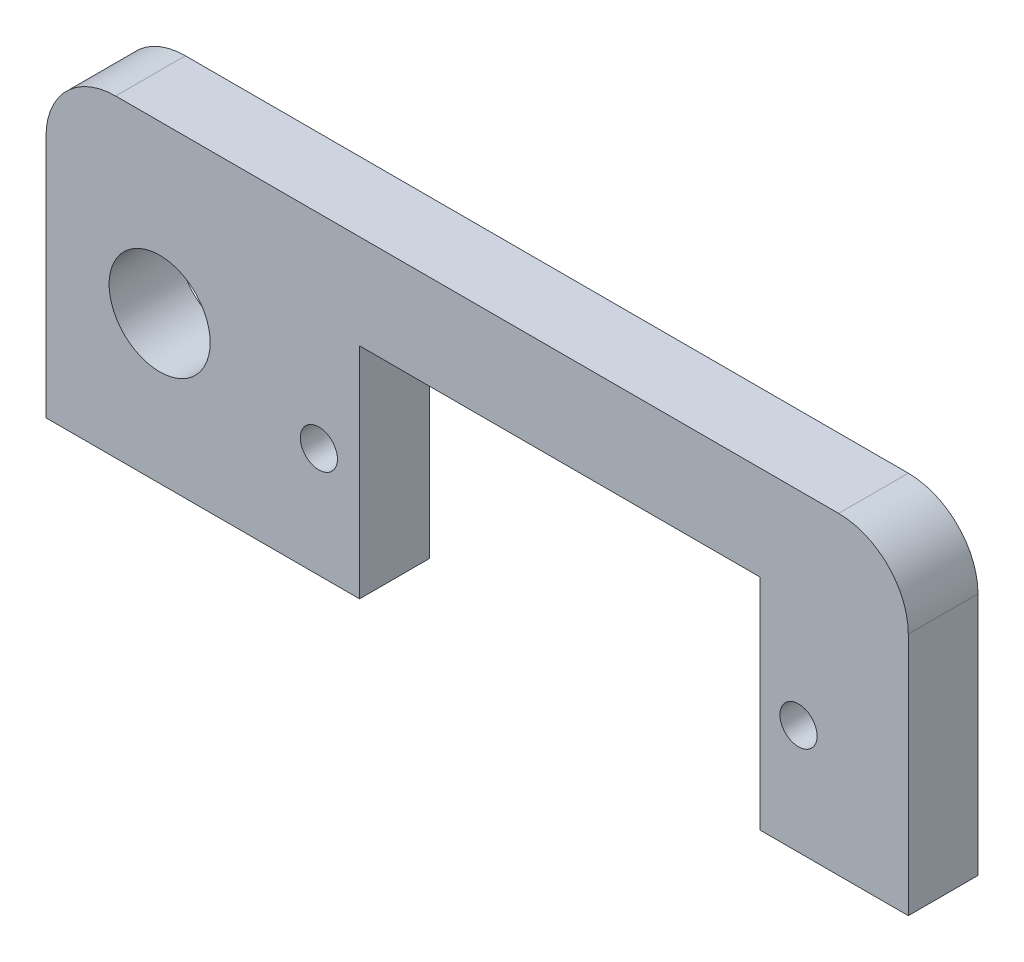
ISO-10303-21;
HEADER;
FILE_DESCRIPTION(('STEP AP214'),'2;1');
FILE_NAME('part.step','',(''),(''),'','','');
FILE_SCHEMA(('AUTOMOTIVE_DESIGN { 1 0 10303 214 1 1 1 1 }'));
ENDSEC;
DATA;
#1=APPLICATION_CONTEXT('core data for automotive mechanical design processes');
#2=APPLICATION_PROTOCOL_DEFINITION('international standard','automotive_design',2000,#1);
#3=PRODUCT_CONTEXT('',#1,'mechanical');
#4=PRODUCT('Part','Part','',(#3));
#5=PRODUCT_RELATED_PRODUCT_CATEGORY('part','',(#4));
#6=PRODUCT_DEFINITION_FORMATION('','',#4);
#7=PRODUCT_DEFINITION_CONTEXT('part definition',#1,'design');
#8=PRODUCT_DEFINITION('design','',#6,#7);
#9=PRODUCT_DEFINITION_SHAPE('','',#8);
#10=(LENGTH_UNIT() NAMED_UNIT(*) SI_UNIT(.MILLI.,.METRE.));
#11=(NAMED_UNIT(*) PLANE_ANGLE_UNIT() SI_UNIT($,.RADIAN.));
#12=(NAMED_UNIT(*) SI_UNIT($,.STERADIAN.) SOLID_ANGLE_UNIT());
#13=UNCERTAINTY_MEASURE_WITH_UNIT(LENGTH_MEASURE(1.E-05),#10,'distance_accuracy_value','');
#14=(GEOMETRIC_REPRESENTATION_CONTEXT(3) GLOBAL_UNCERTAINTY_ASSIGNED_CONTEXT((#13)) GLOBAL_UNIT_ASSIGNED_CONTEXT((#10,
#11,#12)) REPRESENTATION_CONTEXT('',''));
#15=CARTESIAN_POINT('',(0.,0.,0.));
#16=DIRECTION('',(0.,0.,1.));
#17=DIRECTION('',(1.,0.,0.));
#18=AXIS2_PLACEMENT_3D('',#15,#16,#17);
#19=CARTESIAN_POINT('',(27.5,14.,4.));
#20=DIRECTION('',(0.,0.,-1.));
#21=DIRECTION('',(-1.,0.,0.));
#22=AXIS2_PLACEMENT_3D('',#19,#20,#21);
#23=CYLINDRICAL_SURFACE('',#22,4.);
#24=CARTESIAN_POINT('',(27.5,14.,0.));
#25=DIRECTION('',(0.,0.,1.));
#26=DIRECTION('',(1.,0.,0.));
#27=AXIS2_PLACEMENT_3D('',#24,#25,#26);
#28=CIRCLE('',#27,4.);
#29=CARTESIAN_POINT('',(27.5,18.,0.));
#30=VERTEX_POINT('',#29);
#31=CARTESIAN_POINT('',(31.5,14.,0.));
#32=VERTEX_POINT('',#31);
#33=EDGE_CURVE('E141',#30,#32,#28,.F.);
#34=ORIENTED_EDGE('',*,*,#33,.F.);
#35=DIRECTION('',(0.,0.,-1.));
#36=VECTOR('',#35,1.);
#37=CARTESIAN_POINT('',(27.5,18.,4.));
#38=LINE('',#37,#36);
#39=CARTESIAN_POINT('',(27.5,18.,4.));
#40=VERTEX_POINT('',#39);
#41=EDGE_CURVE('E11',#40,#30,#38,.T.);
#42=ORIENTED_EDGE('',*,*,#41,.F.);
#43=CARTESIAN_POINT('',(27.5,14.,4.));
#44=DIRECTION('',(0.,0.,1.));
#45=DIRECTION('',(1.,0.,0.));
#46=AXIS2_PLACEMENT_3D('',#43,#44,#45);
#47=CIRCLE('',#46,4.);
#48=CARTESIAN_POINT('',(31.5,14.,4.));
#49=VERTEX_POINT('',#48);
#50=EDGE_CURVE('E164',#40,#49,#47,.F.);
#51=ORIENTED_EDGE('',*,*,#50,.T.);
#52=DIRECTION('',(0.,0.,-1.));
#53=VECTOR('',#52,1.);
#54=CARTESIAN_POINT('',(31.5,14.,4.));
#55=LINE('',#54,#53);
#56=EDGE_CURVE('E91',#49,#32,#55,.T.);
#57=ORIENTED_EDGE('',*,*,#56,.T.);
#58=EDGE_LOOP('',(#34,#42,#51,#57));
#59=FACE_BOUND('',#58,.T.);
#60=ADVANCED_FACE('F35',(#59),#23,.T.);
#61=CARTESIAN_POINT('',(0.,18.,4.));
#62=DIRECTION('',(0.,1.,0.));
#63=DIRECTION('',(0.,0.,1.));
#64=AXIS2_PLACEMENT_3D('',#61,#62,#63);
#65=PLANE('',#64);
#66=DIRECTION('',(1.,0.,0.));
#67=VECTOR('',#66,1.);
#68=CARTESIAN_POINT('',(0.,18.,0.));
#69=LINE('',#68,#67);
#70=CARTESIAN_POINT('',(-14.,18.,0.));
#71=VERTEX_POINT('',#70);
#72=EDGE_CURVE('E144',#71,#30,#69,.T.);
#73=ORIENTED_EDGE('',*,*,#72,.F.);
#74=DIRECTION('',(0.,0.,-1.));
#75=VECTOR('',#74,1.);
#76=CARTESIAN_POINT('',(-14.,18.,4.));
#77=LINE('',#76,#75);
#78=CARTESIAN_POINT('',(-14.,18.,4.));
#79=VERTEX_POINT('',#78);
#80=EDGE_CURVE('E43',#79,#71,#77,.T.);
#81=ORIENTED_EDGE('',*,*,#80,.F.);
#82=DIRECTION('',(1.,0.,0.));
#83=VECTOR('',#82,1.);
#84=CARTESIAN_POINT('',(0.,18.,4.));
#85=LINE('',#84,#83);
#86=EDGE_CURVE('E199',#79,#40,#85,.T.);
#87=ORIENTED_EDGE('',*,*,#86,.T.);
#88=ORIENTED_EDGE('',*,*,#41,.T.);
#89=EDGE_LOOP('',(#73,#81,#87,#88));
#90=FACE_BOUND('',#89,.T.);
#91=ADVANCED_FACE('F187',(#90),#65,.T.);
#92=CARTESIAN_POINT('',(-14.,14.,4.));
#93=DIRECTION('',(0.,0.,-1.));
#94=DIRECTION('',(-1.,0.,0.));
#95=AXIS2_PLACEMENT_3D('',#92,#93,#94);
#96=CYLINDRICAL_SURFACE('',#95,4.);
#97=CARTESIAN_POINT('',(-14.,14.,0.));
#98=DIRECTION('',(0.,0.,1.));
#99=DIRECTION('',(1.,0.,0.));
#100=AXIS2_PLACEMENT_3D('',#97,#98,#99);
#101=CIRCLE('',#100,4.);
#102=CARTESIAN_POINT('',(-18.,14.,0.));
#103=VERTEX_POINT('',#102);
#104=EDGE_CURVE('E148',#103,#71,#101,.F.);
#105=ORIENTED_EDGE('',*,*,#104,.F.);
#106=DIRECTION('',(0.,0.,-1.));
#107=VECTOR('',#106,1.);
#108=CARTESIAN_POINT('',(-18.,14.,4.));
#109=LINE('',#108,#107);
#110=CARTESIAN_POINT('',(-18.,14.,4.));
#111=VERTEX_POINT('',#110);
#112=EDGE_CURVE('E176',#111,#103,#109,.T.);
#113=ORIENTED_EDGE('',*,*,#112,.F.);
#114=CARTESIAN_POINT('',(-14.,14.,4.));
#115=DIRECTION('',(0.,0.,1.));
#116=DIRECTION('',(1.,0.,0.));
#117=AXIS2_PLACEMENT_3D('',#114,#115,#116);
#118=CIRCLE('',#117,4.);
#119=EDGE_CURVE('E183',#111,#79,#118,.F.);
#120=ORIENTED_EDGE('',*,*,#119,.T.);
#121=ORIENTED_EDGE('',*,*,#80,.T.);
#122=EDGE_LOOP('',(#105,#113,#120,#121));
#123=FACE_BOUND('',#122,.T.);
#124=ADVANCED_FACE('F181',(#123),#96,.T.);
#125=CARTESIAN_POINT('',(-18.,0.,4.));
#126=DIRECTION('',(-1.,0.,0.));
#127=DIRECTION('',(0.,0.,1.));
#128=AXIS2_PLACEMENT_3D('',#125,#126,#127);
#129=PLANE('',#128);
#130=DIRECTION('',(0.,1.,0.));
#131=VECTOR('',#130,1.);
#132=CARTESIAN_POINT('',(-18.,0.,0.));
#133=LINE('',#132,#131);
#134=CARTESIAN_POINT('',(-18.,0.,0.));
#135=VERTEX_POINT('',#134);
#136=EDGE_CURVE('E151',#135,#103,#133,.T.);
#137=ORIENTED_EDGE('',*,*,#136,.F.);
#138=DIRECTION('',(0.,0.,-1.));
#139=VECTOR('',#138,1.);
#140=CARTESIAN_POINT('',(-18.,0.,4.));
#141=LINE('',#140,#139);
#142=CARTESIAN_POINT('',(-18.,0.,4.));
#143=VERTEX_POINT('',#142);
#144=EDGE_CURVE('E174',#143,#135,#141,.T.);
#145=ORIENTED_EDGE('',*,*,#144,.F.);
#146=DIRECTION('',(0.,1.,0.));
#147=VECTOR('',#146,1.);
#148=CARTESIAN_POINT('',(-18.,0.,4.));
#149=LINE('',#148,#147);
#150=EDGE_CURVE('E198',#143,#111,#149,.T.);
#151=ORIENTED_EDGE('',*,*,#150,.T.);
#152=ORIENTED_EDGE('',*,*,#112,.T.);
#153=EDGE_LOOP('',(#137,#145,#151,#152));
#154=FACE_BOUND('',#153,.T.);
#155=ADVANCED_FACE('F194',(#154),#129,.T.);
#156=CARTESIAN_POINT('',(0.,0.,4.));
#157=DIRECTION('',(0.,1.,0.));
#158=DIRECTION('',(0.,0.,1.));
#159=AXIS2_PLACEMENT_3D('',#156,#157,#158);
#160=PLANE('',#159);
#161=DIRECTION('',(1.,0.,0.));
#162=VECTOR('',#161,1.);
#163=CARTESIAN_POINT('',(0.,0.,0.));
#164=LINE('',#163,#162);
#165=CARTESIAN_POINT('',(0.,0.,0.));
#166=VERTEX_POINT('',#165);
#167=EDGE_CURVE('E154',#135,#166,#164,.T.);
#168=ORIENTED_EDGE('',*,*,#167,.T.);
#169=DIRECTION('',(0.,0.,-1.));
#170=VECTOR('',#169,1.);
#171=CARTESIAN_POINT('',(0.,0.,4.));
#172=LINE('',#171,#170);
#173=CARTESIAN_POINT('',(0.,0.,4.));
#174=VERTEX_POINT('',#173);
#175=EDGE_CURVE('E171',#174,#166,#172,.T.);
#176=ORIENTED_EDGE('',*,*,#175,.F.);
#177=DIRECTION('',(1.,0.,0.));
#178=VECTOR('',#177,1.);
#179=CARTESIAN_POINT('',(0.,0.,4.));
#180=LINE('',#179,#178);
#181=EDGE_CURVE('E130',#143,#174,#180,.T.);
#182=ORIENTED_EDGE('',*,*,#181,.F.);
#183=ORIENTED_EDGE('',*,*,#144,.T.);
#184=EDGE_LOOP('',(#168,#176,#182,#183));
#185=FACE_BOUND('',#184,.T.);
#186=ADVANCED_FACE('F273',(#185),#160,.F.);
#187=CARTESIAN_POINT('',(0.,0.,4.));
#188=DIRECTION('',(-1.,0.,0.));
#189=DIRECTION('',(0.,0.,1.));
#190=AXIS2_PLACEMENT_3D('',#187,#188,#189);
#191=PLANE('',#190);
#192=DIRECTION('',(0.,1.,0.));
#193=VECTOR('',#192,1.);
#194=CARTESIAN_POINT('',(0.,0.,0.));
#195=LINE('',#194,#193);
#196=CARTESIAN_POINT('',(0.,12.58,0.));
#197=VERTEX_POINT('',#196);
#198=EDGE_CURVE('E156',#166,#197,#195,.T.);
#199=ORIENTED_EDGE('',*,*,#198,.T.);
#200=DIRECTION('',(0.,0.,-1.));
#201=VECTOR('',#200,1.);
#202=CARTESIAN_POINT('',(0.,12.58,4.));
#203=LINE('',#202,#201);
#204=CARTESIAN_POINT('',(0.,12.58,4.));
#205=VERTEX_POINT('',#204);
#206=EDGE_CURVE('E168',#205,#197,#203,.T.);
#207=ORIENTED_EDGE('',*,*,#206,.F.);
#208=DIRECTION('',(0.,1.,0.));
#209=VECTOR('',#208,1.);
#210=CARTESIAN_POINT('',(0.,0.,4.));
#211=LINE('',#210,#209);
#212=EDGE_CURVE('E136',#174,#205,#211,.T.);
#213=ORIENTED_EDGE('',*,*,#212,.F.);
#214=ORIENTED_EDGE('',*,*,#175,.T.);
#215=EDGE_LOOP('',(#199,#207,#213,#214));
#216=FACE_BOUND('',#215,.T.);
#217=ADVANCED_FACE('F208',(#216),#191,.F.);
#218=CARTESIAN_POINT('',(0.,12.58,4.));
#219=DIRECTION('',(0.,1.,0.));
#220=DIRECTION('',(0.,0.,1.));
#221=AXIS2_PLACEMENT_3D('',#218,#219,#220);
#222=PLANE('',#221);
#223=DIRECTION('',(1.,0.,0.));
#224=VECTOR('',#223,1.);
#225=CARTESIAN_POINT('',(0.,12.58,0.));
#226=LINE('',#225,#224);
#227=CARTESIAN_POINT('',(23.,12.58,0.));
#228=VERTEX_POINT('',#227);
#229=EDGE_CURVE('E158',#197,#228,#226,.T.);
#230=ORIENTED_EDGE('',*,*,#229,.T.);
#231=DIRECTION('',(0.,0.,-1.));
#232=VECTOR('',#231,1.);
#233=CARTESIAN_POINT('',(23.,12.58,4.));
#234=LINE('',#233,#232);
#235=CARTESIAN_POINT('',(23.,12.58,4.));
#236=VERTEX_POINT('',#235);
#237=EDGE_CURVE('E124',#236,#228,#234,.T.);
#238=ORIENTED_EDGE('',*,*,#237,.F.);
#239=DIRECTION('',(1.,0.,0.));
#240=VECTOR('',#239,1.);
#241=CARTESIAN_POINT('',(0.,12.58,4.));
#242=LINE('',#241,#240);
#243=EDGE_CURVE('E133',#205,#236,#242,.T.);
#244=ORIENTED_EDGE('',*,*,#243,.F.);
#245=ORIENTED_EDGE('',*,*,#206,.T.);
#246=EDGE_LOOP('',(#230,#238,#244,#245));
#247=FACE_BOUND('',#246,.T.);
#248=ADVANCED_FACE('F211',(#247),#222,.F.);
#249=CARTESIAN_POINT('',(23.,0.,4.));
#250=DIRECTION('',(-1.,0.,0.));
#251=DIRECTION('',(0.,0.,1.));
#252=AXIS2_PLACEMENT_3D('',#249,#250,#251);
#253=PLANE('',#252);
#254=DIRECTION('',(0.,1.,0.));
#255=VECTOR('',#254,1.);
#256=CARTESIAN_POINT('',(23.,0.,0.));
#257=LINE('',#256,#255);
#258=CARTESIAN_POINT('',(23.,0.,0.));
#259=VERTEX_POINT('',#258);
#260=EDGE_CURVE('E123',#259,#228,#257,.T.);
#261=ORIENTED_EDGE('',*,*,#260,.F.);
#262=DIRECTION('',(0.,0.,-1.));
#263=VECTOR('',#262,1.);
#264=CARTESIAN_POINT('',(23.,0.,4.));
#265=LINE('',#264,#263);
#266=CARTESIAN_POINT('',(23.,0.,4.));
#267=VERTEX_POINT('',#266);
#268=EDGE_CURVE('E117',#267,#259,#265,.T.);
#269=ORIENTED_EDGE('',*,*,#268,.F.);
#270=DIRECTION('',(0.,1.,0.));
#271=VECTOR('',#270,1.);
#272=CARTESIAN_POINT('',(23.,0.,4.));
#273=LINE('',#272,#271);
#274=EDGE_CURVE('E121',#267,#236,#273,.T.);
#275=ORIENTED_EDGE('',*,*,#274,.T.);
#276=ORIENTED_EDGE('',*,*,#237,.T.);
#277=EDGE_LOOP('',(#261,#269,#275,#276));
#278=FACE_BOUND('',#277,.T.);
#279=ADVANCED_FACE('F119',(#278),#253,.T.);
#280=CARTESIAN_POINT('',(31.5,0.,0.));
#281=VERTEX_POINT('',#280);
#282=EDGE_CURVE('E84',#259,#281,#164,.T.);
#283=ORIENTED_EDGE('',*,*,#282,.T.);
#284=DIRECTION('',(0.,0.,-1.));
#285=VECTOR('',#284,1.);
#286=CARTESIAN_POINT('',(31.5,0.,4.));
#287=LINE('',#286,#285);
#288=CARTESIAN_POINT('',(31.5,0.,4.));
#289=VERTEX_POINT('',#288);
#290=EDGE_CURVE('E125',#289,#281,#287,.T.);
#291=ORIENTED_EDGE('',*,*,#290,.F.);
#292=EDGE_CURVE('E127',#267,#289,#180,.T.);
#293=ORIENTED_EDGE('',*,*,#292,.F.);
#294=ORIENTED_EDGE('',*,*,#268,.T.);
#295=EDGE_LOOP('',(#283,#291,#293,#294));
#296=FACE_BOUND('',#295,.T.);
#297=ADVANCED_FACE('F128',(#296),#160,.F.);
#298=CARTESIAN_POINT('',(31.5,0.,4.));
#299=DIRECTION('',(-1.,0.,0.));
#300=DIRECTION('',(0.,0.,1.));
#301=AXIS2_PLACEMENT_3D('',#298,#299,#300);
#302=PLANE('',#301);
#303=DIRECTION('',(0.,1.,0.));
#304=VECTOR('',#303,1.);
#305=CARTESIAN_POINT('',(31.5,0.,0.));
#306=LINE('',#305,#304);
#307=EDGE_CURVE('E162',#281,#32,#306,.T.);
#308=ORIENTED_EDGE('',*,*,#307,.T.);
#309=ORIENTED_EDGE('',*,*,#56,.F.);
#310=DIRECTION('',(0.,1.,0.));
#311=VECTOR('',#310,1.);
#312=CARTESIAN_POINT('',(31.5,0.,4.));
#313=LINE('',#312,#311);
#314=EDGE_CURVE('E51',#289,#49,#313,.T.);
#315=ORIENTED_EDGE('',*,*,#314,.F.);
#316=ORIENTED_EDGE('',*,*,#290,.T.);
#317=EDGE_LOOP('',(#308,#309,#315,#316));
#318=FACE_BOUND('',#317,.T.);
#319=ADVANCED_FACE('F214',(#318),#302,.F.);
#320=CARTESIAN_POINT('',(0.,0.,4.));
#321=DIRECTION('',(0.,0.,1.));
#322=DIRECTION('',(1.,0.,0.));
#323=AXIS2_PLACEMENT_3D('',#320,#321,#322);
#324=PLANE('',#323);
#325=CARTESIAN_POINT('',(-11.476,8.45000000000002,4.));
#326=DIRECTION('',(0.,0.,1.));
#327=DIRECTION('',(1.,0.,0.));
#328=AXIS2_PLACEMENT_3D('',#325,#326,#327);
#329=CIRCLE('',#328,2.9);
#330=CARTESIAN_POINT('',(-8.576,8.45000000000002,4.));
#331=VERTEX_POINT('',#330);
#332=EDGE_CURVE('E228',#331,#331,#329,.T.);
#333=ORIENTED_EDGE('',*,*,#332,.F.);
#334=EDGE_LOOP('',(#333));
#335=FACE_BOUND('',#334,.T.);
#336=CARTESIAN_POINT('',(-2.33680000000001,6.31190000000001,4.));
#337=DIRECTION('',(0.,0.,1.));
#338=DIRECTION('',(1.,0.,0.));
#339=AXIS2_PLACEMENT_3D('',#336,#337,#338);
#340=CIRCLE('',#339,1.0668);
#341=CARTESIAN_POINT('',(-1.27000000000001,6.31190000000001,4.));
#342=VERTEX_POINT('',#341);
#343=EDGE_CURVE('E222',#342,#342,#340,.T.);
#344=ORIENTED_EDGE('',*,*,#343,.F.);
#345=EDGE_LOOP('',(#344));
#346=FACE_BOUND('',#345,.T.);
#347=CARTESIAN_POINT('',(25.1968,6.31190000000001,4.));
#348=DIRECTION('',(0.,0.,1.));
#349=DIRECTION('',(1.,0.,0.));
#350=AXIS2_PLACEMENT_3D('',#347,#348,#349);
#351=CIRCLE('',#350,1.0668);
#352=CARTESIAN_POINT('',(26.2636,6.31190000000001,4.));
#353=VERTEX_POINT('',#352);
#354=EDGE_CURVE('E216',#353,#353,#351,.T.);
#355=ORIENTED_EDGE('',*,*,#354,.F.);
#356=EDGE_LOOP('',(#355));
#357=FACE_BOUND('',#356,.T.);
#358=ORIENTED_EDGE('',*,*,#50,.F.);
#359=ORIENTED_EDGE('',*,*,#86,.F.);
#360=ORIENTED_EDGE('',*,*,#119,.F.);
#361=ORIENTED_EDGE('',*,*,#150,.F.);
#362=ORIENTED_EDGE('',*,*,#181,.T.);
#363=ORIENTED_EDGE('',*,*,#212,.T.);
#364=ORIENTED_EDGE('',*,*,#243,.T.);
#365=ORIENTED_EDGE('',*,*,#274,.F.);
#366=ORIENTED_EDGE('',*,*,#292,.T.);
#367=ORIENTED_EDGE('',*,*,#314,.T.);
#368=EDGE_LOOP('',(#358,#359,#360,#361,#362,#363,#364,#365,#366,#367));
#369=FACE_BOUND('',#368,.T.);
#370=ADVANCED_FACE('F131',(#335,#346,#357,#369),#324,.T.);
#371=CARTESIAN_POINT('',(0.,0.,0.));
#372=DIRECTION('',(0.,0.,1.));
#373=DIRECTION('',(1.,0.,0.));
#374=AXIS2_PLACEMENT_3D('',#371,#372,#373);
#375=PLANE('',#374);
#376=CARTESIAN_POINT('',(-11.476,8.45000000000002,0.));
#377=DIRECTION('',(0.,0.,1.));
#378=DIRECTION('',(1.,0.,0.));
#379=AXIS2_PLACEMENT_3D('',#376,#377,#378);
#380=CIRCLE('',#379,2.9);
#381=CARTESIAN_POINT('',(-8.576,8.45000000000002,0.));
#382=VERTEX_POINT('',#381);
#383=EDGE_CURVE('E219',#382,#382,#380,.T.);
#384=ORIENTED_EDGE('',*,*,#383,.T.);
#385=EDGE_LOOP('',(#384));
#386=FACE_BOUND('',#385,.T.);
#387=CARTESIAN_POINT('',(-2.33680000000001,6.31190000000001,0.));
#388=DIRECTION('',(0.,0.,1.));
#389=DIRECTION('',(1.,0.,0.));
#390=AXIS2_PLACEMENT_3D('',#387,#388,#389);
#391=CIRCLE('',#390,1.0668);
#392=CARTESIAN_POINT('',(-1.27000000000001,6.31190000000001,0.));
#393=VERTEX_POINT('',#392);
#394=EDGE_CURVE('E225',#393,#393,#391,.T.);
#395=ORIENTED_EDGE('',*,*,#394,.T.);
#396=EDGE_LOOP('',(#395));
#397=FACE_BOUND('',#396,.T.);
#398=CARTESIAN_POINT('',(25.1968,6.31190000000001,0.));
#399=DIRECTION('',(0.,0.,1.));
#400=DIRECTION('',(1.,0.,0.));
#401=AXIS2_PLACEMENT_3D('',#398,#399,#400);
#402=CIRCLE('',#401,1.0668);
#403=CARTESIAN_POINT('',(26.2636,6.31190000000001,0.));
#404=VERTEX_POINT('',#403);
#405=EDGE_CURVE('E145',#404,#404,#402,.T.);
#406=ORIENTED_EDGE('',*,*,#405,.T.);
#407=EDGE_LOOP('',(#406));
#408=FACE_BOUND('',#407,.T.);
#409=ORIENTED_EDGE('',*,*,#33,.T.);
#410=ORIENTED_EDGE('',*,*,#307,.F.);
#411=ORIENTED_EDGE('',*,*,#282,.F.);
#412=ORIENTED_EDGE('',*,*,#260,.T.);
#413=ORIENTED_EDGE('',*,*,#229,.F.);
#414=ORIENTED_EDGE('',*,*,#198,.F.);
#415=ORIENTED_EDGE('',*,*,#167,.F.);
#416=ORIENTED_EDGE('',*,*,#136,.T.);
#417=ORIENTED_EDGE('',*,*,#104,.T.);
#418=ORIENTED_EDGE('',*,*,#72,.T.);
#419=EDGE_LOOP('',(#409,#410,#411,#412,#413,#414,#415,#416,#417,#418));
#420=FACE_BOUND('',#419,.T.);
#421=ADVANCED_FACE('F189',(#386,#397,#408,#420),#375,.F.);
#422=CARTESIAN_POINT('',(25.1968,6.31190000000001,0.));
#423=DIRECTION('',(0.,0.,1.));
#424=DIRECTION('',(1.,0.,0.));
#425=AXIS2_PLACEMENT_3D('',#422,#423,#424);
#426=CYLINDRICAL_SURFACE('',#425,1.0668);
#427=ORIENTED_EDGE('',*,*,#405,.F.);
#428=EDGE_LOOP('',(#427));
#429=FACE_BOUND('',#428,.T.);
#430=ORIENTED_EDGE('',*,*,#354,.T.);
#431=EDGE_LOOP('',(#430));
#432=FACE_BOUND('',#431,.T.);
#433=ADVANCED_FACE('F250',(#429,#432),#426,.F.);
#434=CARTESIAN_POINT('',(-2.33680000000001,6.31190000000001,0.));
#435=DIRECTION('',(0.,0.,1.));
#436=DIRECTION('',(1.,0.,0.));
#437=AXIS2_PLACEMENT_3D('',#434,#435,#436);
#438=CYLINDRICAL_SURFACE('',#437,1.0668);
#439=ORIENTED_EDGE('',*,*,#394,.F.);
#440=EDGE_LOOP('',(#439));
#441=FACE_BOUND('',#440,.T.);
#442=ORIENTED_EDGE('',*,*,#343,.T.);
#443=EDGE_LOOP('',(#442));
#444=FACE_BOUND('',#443,.T.);
#445=ADVANCED_FACE('F239',(#441,#444),#438,.F.);
#446=CARTESIAN_POINT('',(-11.476,8.45000000000002,0.));
#447=DIRECTION('',(0.,0.,1.));
#448=DIRECTION('',(1.,0.,0.));
#449=AXIS2_PLACEMENT_3D('',#446,#447,#448);
#450=CYLINDRICAL_SURFACE('',#449,2.9);
#451=ORIENTED_EDGE('',*,*,#383,.F.);
#452=EDGE_LOOP('',(#451));
#453=FACE_BOUND('',#452,.T.);
#454=ORIENTED_EDGE('',*,*,#332,.T.);
#455=EDGE_LOOP('',(#454));
#456=FACE_BOUND('',#455,.T.);
#457=ADVANCED_FACE('F236',(#453,#456),#450,.F.);
#458=CLOSED_SHELL('',(#60,#91,#124,#155,#186,#217,#248,#279,#297,#319,#370,#421,#433,#445,#457));
#459=MANIFOLD_SOLID_BREP('B2',#458);
#460=ADVANCED_BREP_SHAPE_REPRESENTATION('',(#18,#459),#14);
#461=SHAPE_DEFINITION_REPRESENTATION(#9,#460);
ENDSEC;
END-ISO-10303-21;
